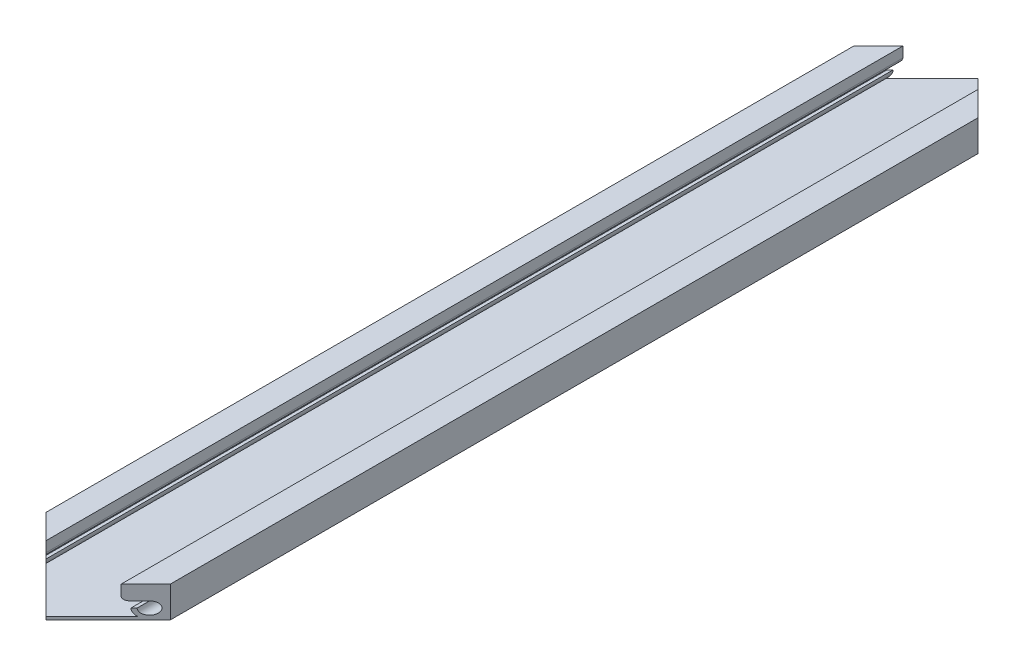
ISO-10303-21;
HEADER;
FILE_DESCRIPTION(('STEP AP214'),'2;1');
FILE_NAME('part.step','',(''),(''),'','','');
FILE_SCHEMA(('AUTOMOTIVE_DESIGN { 1 0 10303 214 1 1 1 1 }'));
ENDSEC;
DATA;
#1=APPLICATION_CONTEXT('core data for automotive mechanical design processes');
#2=APPLICATION_PROTOCOL_DEFINITION('international standard','automotive_design',2000,#1);
#3=PRODUCT_CONTEXT('',#1,'mechanical');
#4=PRODUCT('Part','Part','',(#3));
#5=PRODUCT_RELATED_PRODUCT_CATEGORY('part','',(#4));
#6=PRODUCT_DEFINITION_FORMATION('','',#4);
#7=PRODUCT_DEFINITION_CONTEXT('part definition',#1,'design');
#8=PRODUCT_DEFINITION('design','',#6,#7);
#9=PRODUCT_DEFINITION_SHAPE('','',#8);
#10=(LENGTH_UNIT() NAMED_UNIT(*) SI_UNIT(.MILLI.,.METRE.));
#11=(NAMED_UNIT(*) PLANE_ANGLE_UNIT() SI_UNIT($,.RADIAN.));
#12=(NAMED_UNIT(*) SI_UNIT($,.STERADIAN.) SOLID_ANGLE_UNIT());
#13=UNCERTAINTY_MEASURE_WITH_UNIT(LENGTH_MEASURE(1.E-05),#10,'distance_accuracy_value','');
#14=(GEOMETRIC_REPRESENTATION_CONTEXT(3) GLOBAL_UNCERTAINTY_ASSIGNED_CONTEXT((#13)) GLOBAL_UNIT_ASSIGNED_CONTEXT((#10,
#11,#12)) REPRESENTATION_CONTEXT('',''));
#15=CARTESIAN_POINT('',(0.,0.,0.));
#16=DIRECTION('',(0.,0.,1.));
#17=DIRECTION('',(1.,0.,0.));
#18=AXIS2_PLACEMENT_3D('',#15,#16,#17);
#19=CARTESIAN_POINT('',(-30.,-7.5,450.));
#20=DIRECTION('',(0.,1.,0.));
#21=DIRECTION('',(0.,0.,1.));
#22=AXIS2_PLACEMENT_3D('',#19,#20,#21);
#23=PLANE('',#22);
#24=DIRECTION('',(-0.707106781186552,0.,0.707106781186543));
#25=VECTOR('',#24,1.);
#26=CARTESIAN_POINT('',(225.,-7.5,225.000000000003));
#27=LINE('',#26,#25);
#28=CARTESIAN_POINT('',(30.,-7.5,420.000000000001));
#29=VERTEX_POINT('',#28);
#30=CARTESIAN_POINT('',(0.,-7.5,450.));
#31=VERTEX_POINT('',#30);
#32=EDGE_CURVE('E362',#29,#31,#27,.T.);
#33=ORIENTED_EDGE('',*,*,#32,.T.);
#34=DIRECTION('',(0.707106781186552,0.,0.707106781186543));
#35=VECTOR('',#34,1.);
#36=CARTESIAN_POINT('',(-225.,-7.5,225.000000000003));
#37=LINE('',#36,#35);
#38=CARTESIAN_POINT('',(-30.,-7.5,420.));
#39=VERTEX_POINT('',#38);
#40=EDGE_CURVE('E228',#39,#31,#37,.T.);
#41=ORIENTED_EDGE('',*,*,#40,.F.);
#42=DIRECTION('',(0.,0.,-1.));
#43=VECTOR('',#42,1.);
#44=CARTESIAN_POINT('',(-30.,-7.5,450.));
#45=LINE('',#44,#43);
#46=CARTESIAN_POINT('',(-30.,-7.5,29.9999999999996));
#47=VERTEX_POINT('',#46);
#48=EDGE_CURVE('E237',#39,#47,#45,.T.);
#49=ORIENTED_EDGE('',*,*,#48,.T.);
#50=DIRECTION('',(0.707106781186552,0.,-0.707106781186543));
#51=VECTOR('',#50,1.);
#52=CARTESIAN_POINT('',(0.,-7.5,0.));
#53=LINE('',#52,#51);
#54=CARTESIAN_POINT('',(0.,-7.5,0.));
#55=VERTEX_POINT('',#54);
#56=EDGE_CURVE('E366',#47,#55,#53,.T.);
#57=ORIENTED_EDGE('',*,*,#56,.T.);
#58=DIRECTION('',(-0.707106781186552,0.,-0.707106781186543));
#59=VECTOR('',#58,1.);
#60=CARTESIAN_POINT('',(0.,-7.5,0.));
#61=LINE('',#60,#59);
#62=CARTESIAN_POINT('',(30.,-7.5,29.9999999999996));
#63=VERTEX_POINT('',#62);
#64=EDGE_CURVE('E365',#63,#55,#61,.T.);
#65=ORIENTED_EDGE('',*,*,#64,.F.);
#66=DIRECTION('',(0.,0.,-1.));
#67=VECTOR('',#66,1.);
#68=CARTESIAN_POINT('',(30.,-7.5,450.));
#69=LINE('',#68,#67);
#70=EDGE_CURVE('E252',#29,#63,#69,.T.);
#71=ORIENTED_EDGE('',*,*,#70,.F.);
#72=EDGE_LOOP('',(#33,#41,#49,#57,#65,#71));
#73=FACE_BOUND('',#72,.T.);
#74=ADVANCED_FACE('F80',(#73),#23,.F.);
#75=CARTESIAN_POINT('',(22.1715728752538,-6.,450.));
#76=DIRECTION('',(0.,-1.,0.));
#77=DIRECTION('',(0.,0.,-1.));
#78=AXIS2_PLACEMENT_3D('',#75,#76,#77);
#79=PLANE('',#78);
#80=DIRECTION('',(0.,0.,-1.));
#81=VECTOR('',#80,1.);
#82=CARTESIAN_POINT('',(-22.1715728752538,-6.,450.));
#83=LINE('',#82,#81);
#84=CARTESIAN_POINT('',(-22.1715728752538,-6.,427.828427124746));
#85=VERTEX_POINT('',#84);
#86=CARTESIAN_POINT('',(-22.1715728752538,-6.,22.1715728752536));
#87=VERTEX_POINT('',#86);
#88=EDGE_CURVE('E343',#85,#87,#83,.T.);
#89=ORIENTED_EDGE('',*,*,#88,.F.);
#90=DIRECTION('',(0.707106781186552,0.,0.707106781186543));
#91=VECTOR('',#90,1.);
#92=CARTESIAN_POINT('',(11.0857864376271,-6.,461.085786437627));
#93=LINE('',#92,#91);
#94=CARTESIAN_POINT('',(0.,-6.,450.));
#95=VERTEX_POINT('',#94);
#96=EDGE_CURVE('E417',#85,#95,#93,.T.);
#97=ORIENTED_EDGE('',*,*,#96,.T.);
#98=DIRECTION('',(-0.707106781186552,0.,0.707106781186543));
#99=VECTOR('',#98,1.);
#100=CARTESIAN_POINT('',(11.0857864376271,-6.,438.914213562373));
#101=LINE('',#100,#99);
#102=CARTESIAN_POINT('',(22.1715728752538,-6.,427.828427124746));
#103=VERTEX_POINT('',#102);
#104=EDGE_CURVE('E320',#103,#95,#101,.T.);
#105=ORIENTED_EDGE('',*,*,#104,.F.);
#106=DIRECTION('',(0.,0.,-1.));
#107=VECTOR('',#106,1.);
#108=CARTESIAN_POINT('',(22.1715728752538,-6.,450.));
#109=LINE('',#108,#107);
#110=CARTESIAN_POINT('',(22.1715728752538,-6.,22.1715728752536));
#111=VERTEX_POINT('',#110);
#112=EDGE_CURVE('E326',#103,#111,#109,.T.);
#113=ORIENTED_EDGE('',*,*,#112,.T.);
#114=DIRECTION('',(-0.707106781186552,0.,-0.707106781186543));
#115=VECTOR('',#114,1.);
#116=CARTESIAN_POINT('',(236.085786437627,-6.,236.085786437624));
#117=LINE('',#116,#115);
#118=CARTESIAN_POINT('',(0.,-6.,0.));
#119=VERTEX_POINT('',#118);
#120=EDGE_CURVE('E311',#111,#119,#117,.T.);
#121=ORIENTED_EDGE('',*,*,#120,.T.);
#122=DIRECTION('',(0.707106781186552,0.,-0.707106781186543));
#123=VECTOR('',#122,1.);
#124=CARTESIAN_POINT('',(-213.914213562373,-6.,213.91421356237));
#125=LINE('',#124,#123);
#126=EDGE_CURVE('E370',#87,#119,#125,.T.);
#127=ORIENTED_EDGE('',*,*,#126,.F.);
#128=EDGE_LOOP('',(#89,#97,#105,#113,#121,#127));
#129=FACE_BOUND('',#128,.T.);
#130=ADVANCED_FACE('F402',(#129),#79,.F.);
#131=CARTESIAN_POINT('',(-30.,7.5,450.));
#132=DIRECTION('',(0.,-1.,0.));
#133=DIRECTION('',(0.,0.,-1.));
#134=AXIS2_PLACEMENT_3D('',#131,#132,#133);
#135=PLANE('',#134);
#136=DIRECTION('',(0.,0.,-1.));
#137=VECTOR('',#136,1.);
#138=CARTESIAN_POINT('',(-30.,7.5,450.));
#139=LINE('',#138,#137);
#140=CARTESIAN_POINT('',(-30.,7.5,420.));
#141=VERTEX_POINT('',#140);
#142=CARTESIAN_POINT('',(-30.,7.5,29.9999999999996));
#143=VERTEX_POINT('',#142);
#144=EDGE_CURVE('E235',#141,#143,#139,.T.);
#145=ORIENTED_EDGE('',*,*,#144,.F.);
#146=DIRECTION('',(0.707106781186552,0.,0.707106781186543));
#147=VECTOR('',#146,1.);
#148=CARTESIAN_POINT('',(-225.,7.5,225.000000000003));
#149=LINE('',#148,#147);
#150=CARTESIAN_POINT('',(-18.1568883594902,7.5,431.84311164051));
#151=VERTEX_POINT('',#150);
#152=EDGE_CURVE('E216',#141,#151,#149,.T.);
#153=ORIENTED_EDGE('',*,*,#152,.T.);
#154=DIRECTION('',(0.,0.,-1.));
#155=VECTOR('',#154,1.);
#156=CARTESIAN_POINT('',(-18.1568883594903,7.5,450.));
#157=LINE('',#156,#155);
#158=CARTESIAN_POINT('',(-18.1568883594903,7.5,18.1568883594901));
#159=VERTEX_POINT('',#158);
#160=EDGE_CURVE('E323',#151,#159,#157,.T.);
#161=ORIENTED_EDGE('',*,*,#160,.T.);
#162=DIRECTION('',(0.707106781186552,0.,-0.707106781186543));
#163=VECTOR('',#162,1.);
#164=CARTESIAN_POINT('',(0.,7.5,0.));
#165=LINE('',#164,#163);
#166=EDGE_CURVE('E243',#143,#159,#165,.T.);
#167=ORIENTED_EDGE('',*,*,#166,.F.);
#168=EDGE_LOOP('',(#145,#153,#161,#167));
#169=FACE_BOUND('',#168,.T.);
#170=ADVANCED_FACE('F242',(#169),#135,.F.);
#171=CARTESIAN_POINT('',(25.,0.5,450.));
#172=DIRECTION('',(0.,1.,0.));
#173=DIRECTION('',(-1.,0.,0.));
#174=AXIS2_PLACEMENT_3D('',#171,#172,#173);
#175=PLANE('',#174);
#176=DIRECTION('',(0.,0.,-1.));
#177=VECTOR('',#176,1.);
#178=CARTESIAN_POINT('',(-20.1568883594903,0.5,450.));
#179=LINE('',#178,#177);
#180=CARTESIAN_POINT('',(-20.1568883594903,0.5,20.15688835949));
#181=VERTEX_POINT('',#180);
#182=CARTESIAN_POINT('',(-20.1568883594903,0.5,429.84311164051));
#183=VERTEX_POINT('',#182);
#184=EDGE_CURVE('E267',#181,#183,#179,.F.);
#185=ORIENTED_EDGE('',*,*,#184,.T.);
#186=DIRECTION('',(-0.707106781186552,0.,-0.707106781186543));
#187=VECTOR('',#186,1.);
#188=CARTESIAN_POINT('',(12.5000000000002,0.5,462.5));
#189=LINE('',#188,#187);
#190=CARTESIAN_POINT('',(-25.,0.5,425.));
#191=VERTEX_POINT('',#190);
#192=EDGE_CURVE('E466',#183,#191,#189,.T.);
#193=ORIENTED_EDGE('',*,*,#192,.T.);
#194=DIRECTION('',(0.,0.,-1.));
#195=VECTOR('',#194,1.);
#196=CARTESIAN_POINT('',(-25.,0.5,450.));
#197=LINE('',#196,#195);
#198=CARTESIAN_POINT('',(-25.,0.5,24.9999999999997));
#199=VERTEX_POINT('',#198);
#200=EDGE_CURVE('E335',#191,#199,#197,.T.);
#201=ORIENTED_EDGE('',*,*,#200,.T.);
#202=DIRECTION('',(-0.707106781186552,0.,0.707106781186543));
#203=VECTOR('',#202,1.);
#204=CARTESIAN_POINT('',(-212.5,0.499999999999999,212.499999999997));
#205=LINE('',#204,#203);
#206=EDGE_CURVE('E434',#181,#199,#205,.T.);
#207=ORIENTED_EDGE('',*,*,#206,.F.);
#208=EDGE_LOOP('',(#185,#193,#201,#207));
#209=FACE_BOUND('',#208,.T.);
#210=ADVANCED_FACE('F491',(#209),#175,.F.);
#211=CARTESIAN_POINT('',(-30.,7.5,450.));
#212=DIRECTION('',(1.,0.,0.));
#213=DIRECTION('',(0.,1.,0.));
#214=AXIS2_PLACEMENT_3D('',#211,#212,#213);
#215=PLANE('',#214);
#216=ORIENTED_EDGE('',*,*,#48,.F.);
#217=DIRECTION('',(0.,-1.,0.));
#218=VECTOR('',#217,1.);
#219=CARTESIAN_POINT('',(-30.,7.5,420.));
#220=LINE('',#219,#218);
#221=EDGE_CURVE('E219',#141,#39,#220,.T.);
#222=ORIENTED_EDGE('',*,*,#221,.F.);
#223=ORIENTED_EDGE('',*,*,#144,.T.);
#224=DIRECTION('',(0.,-1.,0.));
#225=VECTOR('',#224,1.);
#226=CARTESIAN_POINT('',(-30.,7.5,29.9999999999996));
#227=LINE('',#226,#225);
#228=EDGE_CURVE('E453',#143,#47,#227,.T.);
#229=ORIENTED_EDGE('',*,*,#228,.T.);
#230=EDGE_LOOP('',(#216,#222,#223,#229));
#231=FACE_BOUND('',#230,.T.);
#232=ADVANCED_FACE('F233',(#231),#215,.F.);
#233=CARTESIAN_POINT('',(-25.,-2.5,450.));
#234=DIRECTION('',(0.,0.,-1.));
#235=DIRECTION('',(-1.,0.,0.));
#236=AXIS2_PLACEMENT_3D('',#233,#234,#235);
#237=CYLINDRICAL_SURFACE('',#236,3.);
#238=ORIENTED_EDGE('',*,*,#200,.F.);
#239=CARTESIAN_POINT('',(-25.,-2.5,425.));
#240=DIRECTION('',(0.707106781186543,0.,-0.707106781186552));
#241=DIRECTION('',(-0.707106781186552,0.,-0.707106781186543));
#242=AXIS2_PLACEMENT_3D('',#239,#240,#241);
#243=ELLIPSE('',#242,4.24264068711926,3.);
#244=CARTESIAN_POINT('',(-22.,-2.5,428.));
#245=VERTEX_POINT('',#244);
#246=EDGE_CURVE('E470',#191,#245,#243,.F.);
#247=ORIENTED_EDGE('',*,*,#246,.T.);
#248=DIRECTION('',(0.,0.,-1.));
#249=VECTOR('',#248,1.);
#250=CARTESIAN_POINT('',(-22.,-2.5,450.));
#251=LINE('',#250,#249);
#252=CARTESIAN_POINT('',(-22.,-2.5,21.9999999999998));
#253=VERTEX_POINT('',#252);
#254=EDGE_CURVE('E259',#245,#253,#251,.T.);
#255=ORIENTED_EDGE('',*,*,#254,.T.);
#256=CARTESIAN_POINT('',(-25.,-2.5,24.9999999999997));
#257=DIRECTION('',(-0.707106781186543,0.,-0.707106781186552));
#258=DIRECTION('',(0.707106781186552,0.,-0.707106781186543));
#259=AXIS2_PLACEMENT_3D('',#256,#257,#258);
#260=ELLIPSE('',#259,4.24264068711927,3.);
#261=EDGE_CURVE('E437',#199,#253,#260,.F.);
#262=ORIENTED_EDGE('',*,*,#261,.F.);
#263=EDGE_LOOP('',(#238,#247,#255,#262));
#264=FACE_BOUND('',#263,.T.);
#265=ADVANCED_FACE('F488',(#264),#237,.F.);
#266=CARTESIAN_POINT('',(-25.,-2.5,450.));
#267=DIRECTION('',(0.,-1.,0.));
#268=DIRECTION('',(1.,0.,0.));
#269=AXIS2_PLACEMENT_3D('',#266,#267,#268);
#270=PLANE('',#269);
#271=ORIENTED_EDGE('',*,*,#254,.F.);
#272=DIRECTION('',(0.707106781186552,0.,0.707106781186543));
#273=VECTOR('',#272,1.);
#274=CARTESIAN_POINT('',(-12.5000000000002,-2.5,437.5));
#275=LINE('',#274,#273);
#276=CARTESIAN_POINT('',(-20.5,-2.5,429.5));
#277=VERTEX_POINT('',#276);
#278=EDGE_CURVE('E428',#245,#277,#275,.T.);
#279=ORIENTED_EDGE('',*,*,#278,.T.);
#280=DIRECTION('',(0.,0.,-1.));
#281=VECTOR('',#280,1.);
#282=CARTESIAN_POINT('',(-20.5,-2.5,450.));
#283=LINE('',#282,#281);
#284=CARTESIAN_POINT('',(-20.5,-2.5,20.4999999999998));
#285=VERTEX_POINT('',#284);
#286=EDGE_CURVE('E339',#277,#285,#283,.T.);
#287=ORIENTED_EDGE('',*,*,#286,.T.);
#288=DIRECTION('',(0.707106781186552,0.,-0.707106781186543));
#289=VECTOR('',#288,1.);
#290=CARTESIAN_POINT('',(-237.5,-2.49999999999994,237.499999999997));
#291=LINE('',#290,#289);
#292=EDGE_CURVE('E440',#253,#285,#291,.T.);
#293=ORIENTED_EDGE('',*,*,#292,.F.);
#294=EDGE_LOOP('',(#271,#279,#287,#293));
#295=FACE_BOUND('',#294,.T.);
#296=ADVANCED_FACE('F478',(#295),#270,.F.);
#297=CARTESIAN_POINT('',(-25.,-2.5,450.));
#298=DIRECTION('',(0.,0.,-1.));
#299=DIRECTION('',(-1.,0.,0.));
#300=AXIS2_PLACEMENT_3D('',#297,#298,#299);
#301=CYLINDRICAL_SURFACE('',#300,4.5);
#302=ORIENTED_EDGE('',*,*,#286,.F.);
#303=CARTESIAN_POINT('',(-25.,-2.5,425.));
#304=DIRECTION('',(0.707106781186543,0.,-0.707106781186552));
#305=DIRECTION('',(-0.707106781186552,0.,-0.707106781186543));
#306=AXIS2_PLACEMENT_3D('',#303,#304,#305);
#307=ELLIPSE('',#306,6.36396103067889,4.5);
#308=EDGE_CURVE('E421',#277,#85,#307,.T.);
#309=ORIENTED_EDGE('',*,*,#308,.T.);
#310=ORIENTED_EDGE('',*,*,#88,.T.);
#311=CARTESIAN_POINT('',(-25.,-2.5,24.9999999999997));
#312=DIRECTION('',(-0.707106781186543,0.,-0.707106781186552));
#313=DIRECTION('',(0.707106781186552,0.,-0.707106781186543));
#314=AXIS2_PLACEMENT_3D('',#311,#312,#313);
#315=ELLIPSE('',#314,6.3639610306789,4.5);
#316=EDGE_CURVE('E375',#285,#87,#315,.T.);
#317=ORIENTED_EDGE('',*,*,#316,.F.);
#318=EDGE_LOOP('',(#302,#309,#310,#317));
#319=FACE_BOUND('',#318,.T.);
#320=ADVANCED_FACE('F482',(#319),#301,.T.);
#321=CARTESIAN_POINT('',(-18.1568883594903,7.5,450.));
#322=DIRECTION('',(-1.,0.,0.));
#323=DIRECTION('',(0.,0.,1.));
#324=AXIS2_PLACEMENT_3D('',#321,#322,#323);
#325=PLANE('',#324);
#326=ORIENTED_EDGE('',*,*,#160,.F.);
#327=DIRECTION('',(0.,-1.,0.));
#328=VECTOR('',#327,1.);
#329=CARTESIAN_POINT('',(-18.1568883594903,7.5,431.84311164051));
#330=LINE('',#329,#328);
#331=CARTESIAN_POINT('',(-18.1568883594903,2.5,431.84311164051));
#332=VERTEX_POINT('',#331);
#333=EDGE_CURVE('E222',#151,#332,#330,.T.);
#334=ORIENTED_EDGE('',*,*,#333,.T.);
#335=DIRECTION('',(0.,0.,-1.));
#336=VECTOR('',#335,1.);
#337=CARTESIAN_POINT('',(-18.1568883594903,2.5,450.));
#338=LINE('',#337,#336);
#339=CARTESIAN_POINT('',(-18.1568883594903,2.5,18.1568883594901));
#340=VERTEX_POINT('',#339);
#341=EDGE_CURVE('E263',#332,#340,#338,.T.);
#342=ORIENTED_EDGE('',*,*,#341,.T.);
#343=DIRECTION('',(0.,-1.,0.));
#344=VECTOR('',#343,1.);
#345=CARTESIAN_POINT('',(-18.1568883594903,7.5,18.1568883594901));
#346=LINE('',#345,#344);
#347=EDGE_CURVE('E426',#159,#340,#346,.T.);
#348=ORIENTED_EDGE('',*,*,#347,.F.);
#349=EDGE_LOOP('',(#326,#334,#342,#348));
#350=FACE_BOUND('',#349,.T.);
#351=ADVANCED_FACE('F498',(#350),#325,.F.);
#352=CARTESIAN_POINT('',(-20.1568883594903,2.5,450.));
#353=DIRECTION('',(0.,0.,-1.));
#354=DIRECTION('',(-1.,0.,0.));
#355=AXIS2_PLACEMENT_3D('',#352,#353,#354);
#356=CYLINDRICAL_SURFACE('',#355,2.);
#357=CARTESIAN_POINT('',(-20.1568883594903,2.5,429.84311164051));
#358=DIRECTION('',(0.707106781186543,0.,-0.707106781186552));
#359=DIRECTION('',(-0.707106781186552,0.,-0.707106781186543));
#360=AXIS2_PLACEMENT_3D('',#357,#358,#359);
#361=ELLIPSE('',#360,2.82842712474617,2.);
#362=EDGE_CURVE('E239',#183,#332,#361,.F.);
#363=ORIENTED_EDGE('',*,*,#362,.F.);
#364=ORIENTED_EDGE('',*,*,#184,.F.);
#365=CARTESIAN_POINT('',(-20.1568883594903,2.5,20.15688835949));
#366=DIRECTION('',(-0.707106781186543,0.,-0.707106781186552));
#367=DIRECTION('',(0.707106781186552,0.,-0.707106781186543));
#368=AXIS2_PLACEMENT_3D('',#365,#366,#367);
#369=ELLIPSE('',#368,2.82842712474617,2.);
#370=EDGE_CURVE('E420',#181,#340,#369,.F.);
#371=ORIENTED_EDGE('',*,*,#370,.T.);
#372=ORIENTED_EDGE('',*,*,#341,.F.);
#373=EDGE_LOOP('',(#363,#364,#371,#372));
#374=FACE_BOUND('',#373,.T.);
#375=ADVANCED_FACE('F495',(#374),#356,.T.);
#376=CARTESIAN_POINT('',(30.,7.5,450.));
#377=DIRECTION('',(-1.,0.,0.));
#378=DIRECTION('',(0.,-1.,0.));
#379=AXIS2_PLACEMENT_3D('',#376,#377,#378);
#380=PLANE('',#379);
#381=DIRECTION('',(0.,-1.,0.));
#382=VECTOR('',#381,1.);
#383=CARTESIAN_POINT('',(30.,7.5,420.000000000001));
#384=LINE('',#383,#382);
#385=CARTESIAN_POINT('',(30.,7.5,420.000000000001));
#386=VERTEX_POINT('',#385);
#387=EDGE_CURVE('E358',#386,#29,#384,.T.);
#388=ORIENTED_EDGE('',*,*,#387,.T.);
#389=ORIENTED_EDGE('',*,*,#70,.T.);
#390=DIRECTION('',(0.,-1.,0.));
#391=VECTOR('',#390,1.);
#392=CARTESIAN_POINT('',(30.,7.5,29.9999999999996));
#393=LINE('',#392,#391);
#394=CARTESIAN_POINT('',(30.,7.5,29.9999999999996));
#395=VERTEX_POINT('',#394);
#396=EDGE_CURVE('E357',#395,#63,#393,.T.);
#397=ORIENTED_EDGE('',*,*,#396,.F.);
#398=DIRECTION('',(0.,0.,-1.));
#399=VECTOR('',#398,1.);
#400=CARTESIAN_POINT('',(30.,7.5,450.));
#401=LINE('',#400,#399);
#402=EDGE_CURVE('E245',#386,#395,#401,.T.);
#403=ORIENTED_EDGE('',*,*,#402,.F.);
#404=EDGE_LOOP('',(#388,#389,#397,#403));
#405=FACE_BOUND('',#404,.T.);
#406=ADVANCED_FACE('F355',(#405),#380,.F.);
#407=DIRECTION('',(-0.707106781186552,0.,0.707106781186543));
#408=VECTOR('',#407,1.);
#409=CARTESIAN_POINT('',(225.,7.5,225.000000000003));
#410=LINE('',#409,#408);
#411=CARTESIAN_POINT('',(18.1431116405097,7.5,431.856888359491));
#412=VERTEX_POINT('',#411);
#413=EDGE_CURVE('E445',#386,#412,#410,.T.);
#414=ORIENTED_EDGE('',*,*,#413,.F.);
#415=ORIENTED_EDGE('',*,*,#402,.T.);
#416=DIRECTION('',(-0.707106781186552,0.,-0.707106781186543));
#417=VECTOR('',#416,1.);
#418=CARTESIAN_POINT('',(0.,7.5,0.));
#419=LINE('',#418,#417);
#420=CARTESIAN_POINT('',(18.1431116405097,7.5,18.1431116405095));
#421=VERTEX_POINT('',#420);
#422=EDGE_CURVE('E369',#395,#421,#419,.T.);
#423=ORIENTED_EDGE('',*,*,#422,.T.);
#424=DIRECTION('',(0.,0.,-1.));
#425=VECTOR('',#424,1.);
#426=CARTESIAN_POINT('',(18.1431116405097,7.5,450.));
#427=LINE('',#426,#425);
#428=EDGE_CURVE('E290',#412,#421,#427,.T.);
#429=ORIENTED_EDGE('',*,*,#428,.F.);
#430=EDGE_LOOP('',(#414,#415,#423,#429));
#431=FACE_BOUND('',#430,.T.);
#432=ADVANCED_FACE('F520',(#431),#135,.F.);
#433=CARTESIAN_POINT('',(25.,-2.5,450.));
#434=DIRECTION('',(0.,0.,-1.));
#435=DIRECTION('',(-1.,0.,0.));
#436=AXIS2_PLACEMENT_3D('',#433,#434,#435);
#437=CYLINDRICAL_SURFACE('',#436,3.);
#438=CARTESIAN_POINT('',(25.,-2.5,425.));
#439=DIRECTION('',(0.707106781186543,0.,0.707106781186552));
#440=DIRECTION('',(0.707106781186552,0.,-0.707106781186543));
#441=AXIS2_PLACEMENT_3D('',#438,#439,#440);
#442=ELLIPSE('',#441,4.24264068711926,3.);
#443=CARTESIAN_POINT('',(25.,0.5,425.));
#444=VERTEX_POINT('',#443);
#445=CARTESIAN_POINT('',(22.,-2.5,428.));
#446=VERTEX_POINT('',#445);
#447=EDGE_CURVE('E305',#444,#446,#442,.F.);
#448=ORIENTED_EDGE('',*,*,#447,.F.);
#449=DIRECTION('',(0.,0.,-1.));
#450=VECTOR('',#449,1.);
#451=CARTESIAN_POINT('',(25.,0.5,450.));
#452=LINE('',#451,#450);
#453=CARTESIAN_POINT('',(25.,0.5,24.9999999999996));
#454=VERTEX_POINT('',#453);
#455=EDGE_CURVE('E303',#444,#454,#452,.T.);
#456=ORIENTED_EDGE('',*,*,#455,.T.);
#457=CARTESIAN_POINT('',(25.,-2.5,24.9999999999997));
#458=DIRECTION('',(-0.707106781186543,0.,0.707106781186552));
#459=DIRECTION('',(-0.707106781186552,0.,-0.707106781186543));
#460=AXIS2_PLACEMENT_3D('',#457,#458,#459);
#461=ELLIPSE('',#460,4.24264068711926,3.);
#462=CARTESIAN_POINT('',(22.,-2.5,21.9999999999998));
#463=VERTEX_POINT('',#462);
#464=EDGE_CURVE('E386',#454,#463,#461,.F.);
#465=ORIENTED_EDGE('',*,*,#464,.T.);
#466=DIRECTION('',(0.,0.,-1.));
#467=VECTOR('',#466,1.);
#468=CARTESIAN_POINT('',(22.,-2.5,450.));
#469=LINE('',#468,#467);
#470=EDGE_CURVE('E250',#463,#446,#469,.F.);
#471=ORIENTED_EDGE('',*,*,#470,.T.);
#472=EDGE_LOOP('',(#448,#456,#465,#471));
#473=FACE_BOUND('',#472,.T.);
#474=ADVANCED_FACE('F414',(#473),#437,.F.);
#475=DIRECTION('',(0.707106781186552,0.,-0.707106781186543));
#476=VECTOR('',#475,1.);
#477=CARTESIAN_POINT('',(12.5000000000002,0.5,437.5));
#478=LINE('',#477,#476);
#479=CARTESIAN_POINT('',(20.1431116405097,0.5,429.856888359491));
#480=VERTEX_POINT('',#479);
#481=EDGE_CURVE('E297',#480,#444,#478,.T.);
#482=ORIENTED_EDGE('',*,*,#481,.F.);
#483=DIRECTION('',(0.,0.,-1.));
#484=VECTOR('',#483,1.);
#485=CARTESIAN_POINT('',(20.1431116405097,0.5,450.));
#486=LINE('',#485,#484);
#487=CARTESIAN_POINT('',(20.1431116405097,0.5,20.1431116405095));
#488=VERTEX_POINT('',#487);
#489=EDGE_CURVE('E271',#480,#488,#486,.T.);
#490=ORIENTED_EDGE('',*,*,#489,.T.);
#491=DIRECTION('',(0.707106781186552,0.,0.707106781186543));
#492=VECTOR('',#491,1.);
#493=CARTESIAN_POINT('',(237.5,0.500000000000001,237.499999999997));
#494=LINE('',#493,#492);
#495=EDGE_CURVE('E96',#488,#454,#494,.T.);
#496=ORIENTED_EDGE('',*,*,#495,.T.);
#497=ORIENTED_EDGE('',*,*,#455,.F.);
#498=EDGE_LOOP('',(#482,#490,#496,#497));
#499=FACE_BOUND('',#498,.T.);
#500=ADVANCED_FACE('F301',(#499),#175,.F.);
#501=CARTESIAN_POINT('',(20.5,-2.5,450.));
#502=DIRECTION('',(0.,-1.,0.));
#503=DIRECTION('',(1.,0.,0.));
#504=AXIS2_PLACEMENT_3D('',#501,#502,#503);
#505=PLANE('',#504);
#506=DIRECTION('',(-0.707106781186552,0.,0.707106781186543));
#507=VECTOR('',#506,1.);
#508=CARTESIAN_POINT('',(10.2500000000001,-2.5,439.75));
#509=LINE('',#508,#507);
#510=CARTESIAN_POINT('',(20.5,-2.5,429.5));
#511=VERTEX_POINT('',#510);
#512=EDGE_CURVE('E309',#446,#511,#509,.T.);
#513=ORIENTED_EDGE('',*,*,#512,.F.);
#514=ORIENTED_EDGE('',*,*,#470,.F.);
#515=DIRECTION('',(-0.707106781186552,0.,-0.707106781186543));
#516=VECTOR('',#515,1.);
#517=CARTESIAN_POINT('',(235.25,-2.50000000000002,235.249999999997));
#518=LINE('',#517,#516);
#519=CARTESIAN_POINT('',(20.5,-2.5,20.4999999999997));
#520=VERTEX_POINT('',#519);
#521=EDGE_CURVE('E390',#463,#520,#518,.T.);
#522=ORIENTED_EDGE('',*,*,#521,.T.);
#523=DIRECTION('',(0.,0.,-1.));
#524=VECTOR('',#523,1.);
#525=CARTESIAN_POINT('',(20.5,-2.5,450.));
#526=LINE('',#525,#524);
#527=EDGE_CURVE('E329',#511,#520,#526,.T.);
#528=ORIENTED_EDGE('',*,*,#527,.F.);
#529=EDGE_LOOP('',(#513,#514,#522,#528));
#530=FACE_BOUND('',#529,.T.);
#531=ADVANCED_FACE('F411',(#530),#505,.F.);
#532=CARTESIAN_POINT('',(25.,-2.5,450.));
#533=DIRECTION('',(0.,0.,-1.));
#534=DIRECTION('',(-1.,0.,0.));
#535=AXIS2_PLACEMENT_3D('',#532,#533,#534);
#536=CYLINDRICAL_SURFACE('',#535,4.5);
#537=CARTESIAN_POINT('',(25.,-2.5,425.));
#538=DIRECTION('',(0.707106781186543,0.,0.707106781186552));
#539=DIRECTION('',(0.707106781186552,0.,-0.707106781186543));
#540=AXIS2_PLACEMENT_3D('',#537,#538,#539);
#541=ELLIPSE('',#540,6.36396103067889,4.5);
#542=EDGE_CURVE('E317',#511,#103,#541,.T.);
#543=ORIENTED_EDGE('',*,*,#542,.F.);
#544=ORIENTED_EDGE('',*,*,#527,.T.);
#545=CARTESIAN_POINT('',(25.,-2.5,24.9999999999997));
#546=DIRECTION('',(-0.707106781186543,0.,0.707106781186552));
#547=DIRECTION('',(-0.707106781186552,0.,-0.707106781186543));
#548=AXIS2_PLACEMENT_3D('',#545,#546,#547);
#549=ELLIPSE('',#548,6.36396103067889,4.5);
#550=EDGE_CURVE('E394',#520,#111,#549,.T.);
#551=ORIENTED_EDGE('',*,*,#550,.T.);
#552=ORIENTED_EDGE('',*,*,#112,.F.);
#553=EDGE_LOOP('',(#543,#544,#551,#552));
#554=FACE_BOUND('',#553,.T.);
#555=ADVANCED_FACE('F407',(#554),#536,.T.);
#556=CARTESIAN_POINT('',(18.1431116405097,0.5,450.));
#557=DIRECTION('',(1.,0.,0.));
#558=DIRECTION('',(0.,0.,-1.));
#559=AXIS2_PLACEMENT_3D('',#556,#557,#558);
#560=PLANE('',#559);
#561=DIRECTION('',(0.,-1.,0.));
#562=VECTOR('',#561,1.);
#563=CARTESIAN_POINT('',(18.1431116405097,0.5,431.856888359491));
#564=LINE('',#563,#562);
#565=CARTESIAN_POINT('',(18.1431116405097,2.5,431.856888359491));
#566=VERTEX_POINT('',#565);
#567=EDGE_CURVE('E104',#412,#566,#564,.T.);
#568=ORIENTED_EDGE('',*,*,#567,.F.);
#569=ORIENTED_EDGE('',*,*,#428,.T.);
#570=DIRECTION('',(0.,-1.,0.));
#571=VECTOR('',#570,1.);
#572=CARTESIAN_POINT('',(18.1431116405097,0.5,18.1431116405095));
#573=LINE('',#572,#571);
#574=CARTESIAN_POINT('',(18.1431116405097,2.5,18.1431116405095));
#575=VERTEX_POINT('',#574);
#576=EDGE_CURVE('E281',#421,#575,#573,.T.);
#577=ORIENTED_EDGE('',*,*,#576,.T.);
#578=DIRECTION('',(0.,0.,-1.));
#579=VECTOR('',#578,1.);
#580=CARTESIAN_POINT('',(18.1431116405097,2.5,450.));
#581=LINE('',#580,#579);
#582=EDGE_CURVE('E275',#575,#566,#581,.F.);
#583=ORIENTED_EDGE('',*,*,#582,.T.);
#584=EDGE_LOOP('',(#568,#569,#577,#583));
#585=FACE_BOUND('',#584,.T.);
#586=ADVANCED_FACE('F288',(#585),#560,.F.);
#587=CARTESIAN_POINT('',(20.1431116405097,2.5,450.));
#588=DIRECTION('',(0.,0.,-1.));
#589=DIRECTION('',(-1.,0.,0.));
#590=AXIS2_PLACEMENT_3D('',#587,#588,#589);
#591=CYLINDRICAL_SURFACE('',#590,2.);
#592=ORIENTED_EDGE('',*,*,#489,.F.);
#593=CARTESIAN_POINT('',(20.1431116405097,2.5,429.856888359491));
#594=DIRECTION('',(0.707106781186543,0.,0.707106781186552));
#595=DIRECTION('',(0.707106781186552,0.,-0.707106781186543));
#596=AXIS2_PLACEMENT_3D('',#593,#594,#595);
#597=ELLIPSE('',#596,2.82842712474617,2.);
#598=EDGE_CURVE('E12',#480,#566,#597,.F.);
#599=ORIENTED_EDGE('',*,*,#598,.T.);
#600=ORIENTED_EDGE('',*,*,#582,.F.);
#601=CARTESIAN_POINT('',(20.1431116405097,2.5,20.1431116405095));
#602=DIRECTION('',(-0.707106781186543,0.,0.707106781186552));
#603=DIRECTION('',(-0.707106781186552,0.,-0.707106781186543));
#604=AXIS2_PLACEMENT_3D('',#601,#602,#603);
#605=ELLIPSE('',#604,2.82842712474617,2.);
#606=EDGE_CURVE('E89',#488,#575,#605,.F.);
#607=ORIENTED_EDGE('',*,*,#606,.F.);
#608=EDGE_LOOP('',(#592,#599,#600,#607));
#609=FACE_BOUND('',#608,.T.);
#610=ADVANCED_FACE('F82',(#609),#591,.T.);
#611=CARTESIAN_POINT('',(0.,7.5,0.));
#612=DIRECTION('',(-0.707106781186543,0.,0.707106781186552));
#613=DIRECTION('',(0.707106781186552,0.,0.707106781186543));
#614=AXIS2_PLACEMENT_3D('',#611,#612,#613);
#615=PLANE('',#614);
#616=ORIENTED_EDGE('',*,*,#550,.F.);
#617=ORIENTED_EDGE('',*,*,#521,.F.);
#618=ORIENTED_EDGE('',*,*,#464,.F.);
#619=ORIENTED_EDGE('',*,*,#495,.F.);
#620=ORIENTED_EDGE('',*,*,#606,.T.);
#621=ORIENTED_EDGE('',*,*,#576,.F.);
#622=ORIENTED_EDGE('',*,*,#422,.F.);
#623=ORIENTED_EDGE('',*,*,#396,.T.);
#624=ORIENTED_EDGE('',*,*,#64,.T.);
#625=DIRECTION('',(0.,-1.,0.));
#626=VECTOR('',#625,1.);
#627=CARTESIAN_POINT('',(0.,7.5,0.));
#628=LINE('',#627,#626);
#629=EDGE_CURVE('E379',#119,#55,#628,.T.);
#630=ORIENTED_EDGE('',*,*,#629,.F.);
#631=ORIENTED_EDGE('',*,*,#120,.F.);
#632=EDGE_LOOP('',(#616,#617,#618,#619,#620,#621,#622,#623,#624,#630,#631));
#633=FACE_BOUND('',#632,.T.);
#634=ADVANCED_FACE('F280',(#633),#615,.F.);
#635=CARTESIAN_POINT('',(225.,7.5,225.000000000003));
#636=DIRECTION('',(0.707106781186543,0.,0.707106781186552));
#637=DIRECTION('',(0.707106781186552,0.,-0.707106781186543));
#638=AXIS2_PLACEMENT_3D('',#635,#636,#637);
#639=PLANE('',#638);
#640=ORIENTED_EDGE('',*,*,#104,.T.);
#641=DIRECTION('',(0.,-1.,0.));
#642=VECTOR('',#641,1.);
#643=CARTESIAN_POINT('',(0.,7.5,450.));
#644=LINE('',#643,#642);
#645=EDGE_CURVE('E292',#95,#31,#644,.T.);
#646=ORIENTED_EDGE('',*,*,#645,.T.);
#647=ORIENTED_EDGE('',*,*,#32,.F.);
#648=ORIENTED_EDGE('',*,*,#387,.F.);
#649=ORIENTED_EDGE('',*,*,#413,.T.);
#650=ORIENTED_EDGE('',*,*,#567,.T.);
#651=ORIENTED_EDGE('',*,*,#598,.F.);
#652=ORIENTED_EDGE('',*,*,#481,.T.);
#653=ORIENTED_EDGE('',*,*,#447,.T.);
#654=ORIENTED_EDGE('',*,*,#512,.T.);
#655=ORIENTED_EDGE('',*,*,#542,.T.);
#656=EDGE_LOOP('',(#640,#646,#647,#648,#649,#650,#651,#652,#653,#654,#655));
#657=FACE_BOUND('',#656,.T.);
#658=ADVANCED_FACE('F296',(#657),#639,.T.);
#659=CARTESIAN_POINT('',(-225.,7.5,225.000000000003));
#660=DIRECTION('',(0.707106781186543,0.,-0.707106781186552));
#661=DIRECTION('',(-0.707106781186552,0.,-0.707106781186543));
#662=AXIS2_PLACEMENT_3D('',#659,#660,#661);
#663=PLANE('',#662);
#664=ORIENTED_EDGE('',*,*,#308,.F.);
#665=ORIENTED_EDGE('',*,*,#278,.F.);
#666=ORIENTED_EDGE('',*,*,#246,.F.);
#667=ORIENTED_EDGE('',*,*,#192,.F.);
#668=ORIENTED_EDGE('',*,*,#362,.T.);
#669=ORIENTED_EDGE('',*,*,#333,.F.);
#670=ORIENTED_EDGE('',*,*,#152,.F.);
#671=ORIENTED_EDGE('',*,*,#221,.T.);
#672=ORIENTED_EDGE('',*,*,#40,.T.);
#673=ORIENTED_EDGE('',*,*,#645,.F.);
#674=ORIENTED_EDGE('',*,*,#96,.F.);
#675=EDGE_LOOP('',(#664,#665,#666,#667,#668,#669,#670,#671,#672,#673,#674));
#676=FACE_BOUND('',#675,.T.);
#677=ADVANCED_FACE('F218',(#676),#663,.F.);
#678=CARTESIAN_POINT('',(0.,7.5,0.));
#679=DIRECTION('',(-0.707106781186543,0.,-0.707106781186552));
#680=DIRECTION('',(-0.707106781186552,0.,0.707106781186543));
#681=AXIS2_PLACEMENT_3D('',#678,#679,#680);
#682=PLANE('',#681);
#683=ORIENTED_EDGE('',*,*,#126,.T.);
#684=ORIENTED_EDGE('',*,*,#629,.T.);
#685=ORIENTED_EDGE('',*,*,#56,.F.);
#686=ORIENTED_EDGE('',*,*,#228,.F.);
#687=ORIENTED_EDGE('',*,*,#166,.T.);
#688=ORIENTED_EDGE('',*,*,#347,.T.);
#689=ORIENTED_EDGE('',*,*,#370,.F.);
#690=ORIENTED_EDGE('',*,*,#206,.T.);
#691=ORIENTED_EDGE('',*,*,#261,.T.);
#692=ORIENTED_EDGE('',*,*,#292,.T.);
#693=ORIENTED_EDGE('',*,*,#316,.T.);
#694=EDGE_LOOP('',(#683,#684,#685,#686,#687,#688,#689,#690,#691,#692,#693));
#695=FACE_BOUND('',#694,.T.);
#696=ADVANCED_FACE('F484',(#695),#682,.T.);
#697=CLOSED_SHELL('',(#74,#130,#170,#210,#232,#265,#296,#320,#351,#375,#406,#432,#474,#500,#531,
#555,#586,#610,#634,#658,#677,#696));
#698=MANIFOLD_SOLID_BREP('B2',#697);
#699=ADVANCED_BREP_SHAPE_REPRESENTATION('',(#18,#698),#14);
#700=SHAPE_DEFINITION_REPRESENTATION(#9,#699);
ENDSEC;
END-ISO-10303-21;
